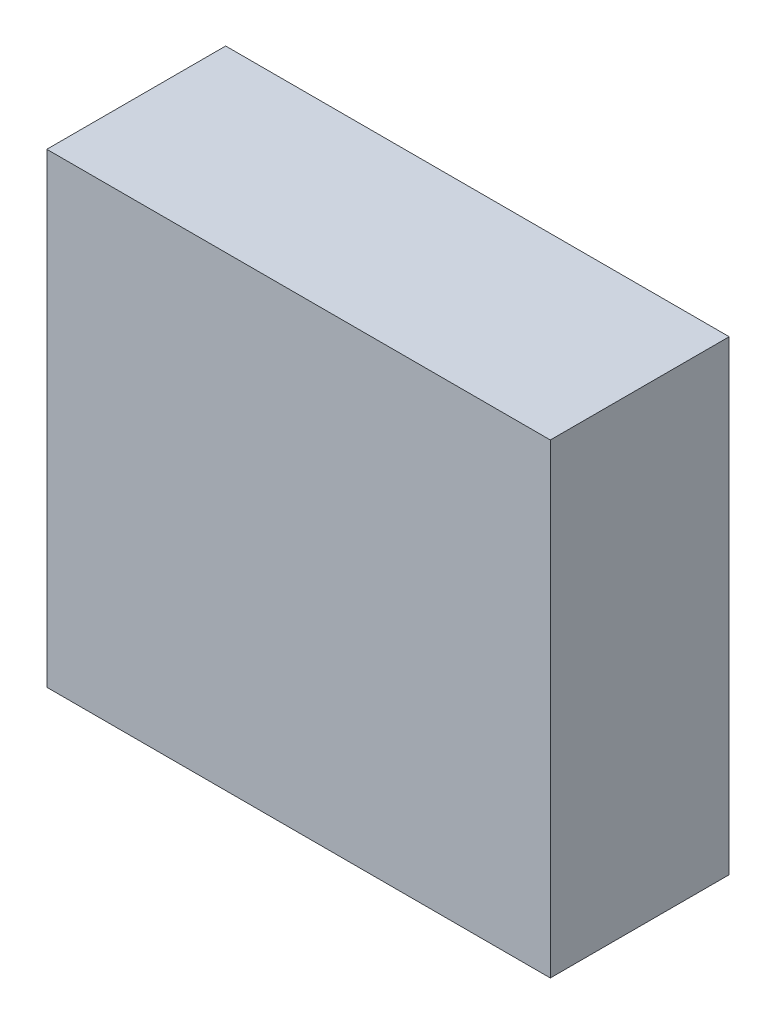
ISO-10303-21;
HEADER;
FILE_DESCRIPTION(('STEP AP214'),'2;1');
FILE_NAME('part.step','',(''),(''),'','','');
FILE_SCHEMA(('AUTOMOTIVE_DESIGN { 1 0 10303 214 1 1 1 1 }'));
ENDSEC;
DATA;
#1=APPLICATION_CONTEXT('core data for automotive mechanical design processes');
#2=APPLICATION_PROTOCOL_DEFINITION('international standard','automotive_design',2000,#1);
#3=PRODUCT_CONTEXT('',#1,'mechanical');
#4=PRODUCT('Part','Part','',(#3));
#5=PRODUCT_RELATED_PRODUCT_CATEGORY('part','',(#4));
#6=PRODUCT_DEFINITION_FORMATION('','',#4);
#7=PRODUCT_DEFINITION_CONTEXT('part definition',#1,'design');
#8=PRODUCT_DEFINITION('design','',#6,#7);
#9=PRODUCT_DEFINITION_SHAPE('','',#8);
#10=(LENGTH_UNIT() NAMED_UNIT(*) SI_UNIT(.MILLI.,.METRE.));
#11=(NAMED_UNIT(*) PLANE_ANGLE_UNIT() SI_UNIT($,.RADIAN.));
#12=(NAMED_UNIT(*) SI_UNIT($,.STERADIAN.) SOLID_ANGLE_UNIT());
#13=UNCERTAINTY_MEASURE_WITH_UNIT(LENGTH_MEASURE(1.E-05),#10,'distance_accuracy_value','');
#14=(GEOMETRIC_REPRESENTATION_CONTEXT(3) GLOBAL_UNCERTAINTY_ASSIGNED_CONTEXT((#13)) GLOBAL_UNIT_ASSIGNED_CONTEXT((#10,
#11,#12)) REPRESENTATION_CONTEXT('',''));
#15=CARTESIAN_POINT('',(0.,0.,0.));
#16=DIRECTION('',(0.,0.,1.));
#17=DIRECTION('',(1.,0.,0.));
#18=AXIS2_PLACEMENT_3D('',#15,#16,#17);
#19=CARTESIAN_POINT('',(-3.34999838,3.09999888,2.38000032));
#20=DIRECTION('',(0.,0.,1.));
#21=DIRECTION('',(1.,0.,0.));
#22=AXIS2_PLACEMENT_3D('',#19,#20,#21);
#23=PLANE('',#22);
#24=DIRECTION('',(0.,1.,0.));
#25=VECTOR('',#24,1.);
#26=CARTESIAN_POINT('',(3.35000092,3.09999888,2.38000032));
#27=LINE('',#26,#25);
#28=CARTESIAN_POINT('',(3.35000092,3.09999888,2.38000032));
#29=VERTEX_POINT('',#28);
#30=CARTESIAN_POINT('',(3.35000092,-3.09999888,2.38000032));
#31=VERTEX_POINT('',#30);
#32=EDGE_CURVE('E53',#29,#31,#27,.F.);
#33=ORIENTED_EDGE('',*,*,#32,.F.);
#34=DIRECTION('',(1.,0.,0.));
#35=VECTOR('',#34,1.);
#36=CARTESIAN_POINT('',(-3.34999838,3.09999888,2.38000032));
#37=LINE('',#36,#35);
#38=CARTESIAN_POINT('',(-3.34999838,3.09999888,2.38000032));
#39=VERTEX_POINT('',#38);
#40=EDGE_CURVE('E68',#39,#29,#37,.T.);
#41=ORIENTED_EDGE('',*,*,#40,.F.);
#42=DIRECTION('',(0.,1.,0.));
#43=VECTOR('',#42,1.);
#44=CARTESIAN_POINT('',(-3.34999838,-3.09999888,2.38000032));
#45=LINE('',#44,#43);
#46=CARTESIAN_POINT('',(-3.34999838,-3.09999888,2.38000032));
#47=VERTEX_POINT('',#46);
#48=EDGE_CURVE('E20',#47,#39,#45,.T.);
#49=ORIENTED_EDGE('',*,*,#48,.F.);
#50=DIRECTION('',(1.,0.,0.));
#51=VECTOR('',#50,1.);
#52=CARTESIAN_POINT('',(3.35000092,-3.09999888,2.38000032));
#53=LINE('',#52,#51);
#54=EDGE_CURVE('E58',#31,#47,#53,.F.);
#55=ORIENTED_EDGE('',*,*,#54,.F.);
#56=EDGE_LOOP('',(#33,#41,#49,#55));
#57=FACE_BOUND('',#56,.T.);
#58=ADVANCED_FACE('F17',(#57),#23,.T.);
#59=CARTESIAN_POINT('',(-3.34999838,-3.09999888,0.));
#60=DIRECTION('',(-1.,0.,0.));
#61=DIRECTION('',(0.,0.,1.));
#62=AXIS2_PLACEMENT_3D('',#59,#60,#61);
#63=PLANE('',#62);
#64=DIRECTION('',(0.,0.,1.));
#65=VECTOR('',#64,1.);
#66=CARTESIAN_POINT('',(-3.34999838,3.09999888,0.));
#67=LINE('',#66,#65);
#68=CARTESIAN_POINT('',(-3.34999838,3.09999888,0.));
#69=VERTEX_POINT('',#68);
#70=EDGE_CURVE('E79',#69,#39,#67,.T.);
#71=ORIENTED_EDGE('',*,*,#70,.F.);
#72=DIRECTION('',(0.,1.,0.));
#73=VECTOR('',#72,1.);
#74=CARTESIAN_POINT('',(-3.34999838,3.09999888,0.));
#75=LINE('',#74,#73);
#76=CARTESIAN_POINT('',(-3.34999838,-3.09999888,0.));
#77=VERTEX_POINT('',#76);
#78=EDGE_CURVE('E74',#69,#77,#75,.F.);
#79=ORIENTED_EDGE('',*,*,#78,.T.);
#80=DIRECTION('',(0.,0.,-1.));
#81=VECTOR('',#80,1.);
#82=CARTESIAN_POINT('',(-3.34999838,-3.09999888,0.));
#83=LINE('',#82,#81);
#84=EDGE_CURVE('E63',#47,#77,#83,.T.);
#85=ORIENTED_EDGE('',*,*,#84,.F.);
#86=ORIENTED_EDGE('',*,*,#48,.T.);
#87=EDGE_LOOP('',(#71,#79,#85,#86));
#88=FACE_BOUND('',#87,.T.);
#89=ADVANCED_FACE('F73',(#88),#63,.T.);
#90=CARTESIAN_POINT('',(3.35000092,-3.09999888,0.));
#91=DIRECTION('',(0.,-1.,0.));
#92=DIRECTION('',(0.,0.,-1.));
#93=AXIS2_PLACEMENT_3D('',#90,#91,#92);
#94=PLANE('',#93);
#95=ORIENTED_EDGE('',*,*,#84,.T.);
#96=DIRECTION('',(1.,0.,0.));
#97=VECTOR('',#96,1.);
#98=CARTESIAN_POINT('',(-3.34999838,-3.09999888,0.));
#99=LINE('',#98,#97);
#100=CARTESIAN_POINT('',(3.35000092,-3.09999888,0.));
#101=VERTEX_POINT('',#100);
#102=EDGE_CURVE('E84',#77,#101,#99,.T.);
#103=ORIENTED_EDGE('',*,*,#102,.T.);
#104=DIRECTION('',(0.,0.,-1.));
#105=VECTOR('',#104,1.);
#106=CARTESIAN_POINT('',(3.35000092,-3.09999888,0.));
#107=LINE('',#106,#105);
#108=EDGE_CURVE('E65',#31,#101,#107,.T.);
#109=ORIENTED_EDGE('',*,*,#108,.F.);
#110=ORIENTED_EDGE('',*,*,#54,.T.);
#111=EDGE_LOOP('',(#95,#103,#109,#110));
#112=FACE_BOUND('',#111,.T.);
#113=ADVANCED_FACE('F60',(#112),#94,.T.);
#114=CARTESIAN_POINT('',(3.35000092,3.09999888,0.));
#115=DIRECTION('',(1.,0.,0.));
#116=DIRECTION('',(0.,0.,-1.));
#117=AXIS2_PLACEMENT_3D('',#114,#115,#116);
#118=PLANE('',#117);
#119=ORIENTED_EDGE('',*,*,#108,.T.);
#120=DIRECTION('',(0.,1.,0.));
#121=VECTOR('',#120,1.);
#122=CARTESIAN_POINT('',(3.35000092,3.09999888,0.));
#123=LINE('',#122,#121);
#124=CARTESIAN_POINT('',(3.35000092,3.09999888,0.));
#125=VERTEX_POINT('',#124);
#126=EDGE_CURVE('E26',#101,#125,#123,.T.);
#127=ORIENTED_EDGE('',*,*,#126,.T.);
#128=DIRECTION('',(0.,0.,1.));
#129=VECTOR('',#128,1.);
#130=CARTESIAN_POINT('',(3.35000092,3.09999888,0.));
#131=LINE('',#130,#129);
#132=EDGE_CURVE('E34',#29,#125,#131,.F.);
#133=ORIENTED_EDGE('',*,*,#132,.F.);
#134=ORIENTED_EDGE('',*,*,#32,.T.);
#135=EDGE_LOOP('',(#119,#127,#133,#134));
#136=FACE_BOUND('',#135,.T.);
#137=ADVANCED_FACE('F88',(#136),#118,.T.);
#138=CARTESIAN_POINT('',(-3.34999838,3.09999888,0.));
#139=DIRECTION('',(0.,1.,0.));
#140=DIRECTION('',(0.,0.,1.));
#141=AXIS2_PLACEMENT_3D('',#138,#139,#140);
#142=PLANE('',#141);
#143=ORIENTED_EDGE('',*,*,#132,.T.);
#144=DIRECTION('',(1.,0.,0.));
#145=VECTOR('',#144,1.);
#146=CARTESIAN_POINT('',(-3.34999838,3.09999888,0.));
#147=LINE('',#146,#145);
#148=EDGE_CURVE('E11',#125,#69,#147,.F.);
#149=ORIENTED_EDGE('',*,*,#148,.T.);
#150=ORIENTED_EDGE('',*,*,#70,.T.);
#151=ORIENTED_EDGE('',*,*,#40,.T.);
#152=EDGE_LOOP('',(#143,#149,#150,#151));
#153=FACE_BOUND('',#152,.T.);
#154=ADVANCED_FACE('F91',(#153),#142,.T.);
#155=CARTESIAN_POINT('',(-3.34999838,3.09999888,0.));
#156=DIRECTION('',(0.,0.,1.));
#157=DIRECTION('',(1.,0.,0.));
#158=AXIS2_PLACEMENT_3D('',#155,#156,#157);
#159=PLANE('',#158);
#160=ORIENTED_EDGE('',*,*,#126,.F.);
#161=ORIENTED_EDGE('',*,*,#102,.F.);
#162=ORIENTED_EDGE('',*,*,#78,.F.);
#163=ORIENTED_EDGE('',*,*,#148,.F.);
#164=EDGE_LOOP('',(#160,#161,#162,#163));
#165=FACE_BOUND('',#164,.T.);
#166=ADVANCED_FACE('F90',(#165),#159,.F.);
#167=CLOSED_SHELL('',(#58,#89,#113,#137,#154,#166));
#168=MANIFOLD_SOLID_BREP('B1',#167);
#169=ADVANCED_BREP_SHAPE_REPRESENTATION('',(#18,#168),#14);
#170=SHAPE_DEFINITION_REPRESENTATION(#9,#169);
ENDSEC;
END-ISO-10303-21;
